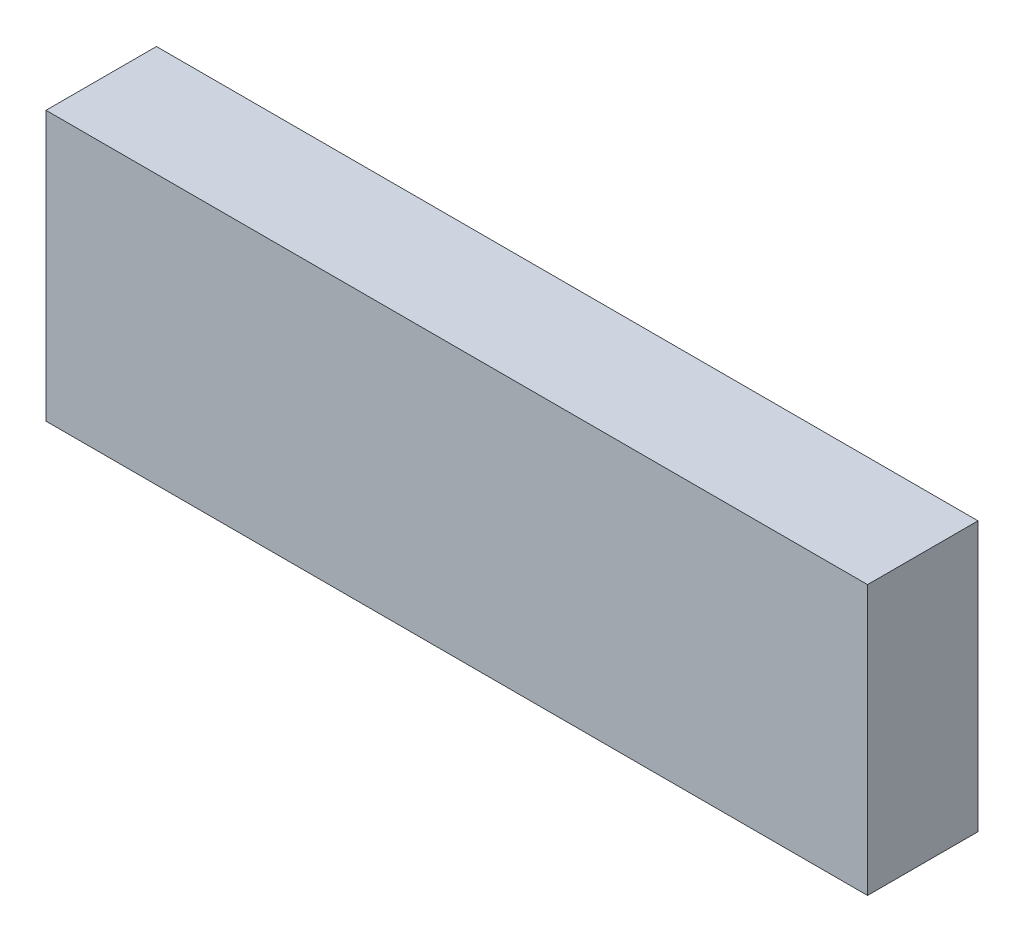
ISO-10303-21;
HEADER;
FILE_DESCRIPTION(('STEP AP214'),'2;1');
FILE_NAME('part.step','',(''),(''),'','','');
FILE_SCHEMA(('AUTOMOTIVE_DESIGN { 1 0 10303 214 1 1 1 1 }'));
ENDSEC;
DATA;
#1=APPLICATION_CONTEXT('core data for automotive mechanical design processes');
#2=APPLICATION_PROTOCOL_DEFINITION('international standard','automotive_design',2000,#1);
#3=PRODUCT_CONTEXT('',#1,'mechanical');
#4=PRODUCT('Part','Part','',(#3));
#5=PRODUCT_RELATED_PRODUCT_CATEGORY('part','',(#4));
#6=PRODUCT_DEFINITION_FORMATION('','',#4);
#7=PRODUCT_DEFINITION_CONTEXT('part definition',#1,'design');
#8=PRODUCT_DEFINITION('design','',#6,#7);
#9=PRODUCT_DEFINITION_SHAPE('','',#8);
#10=(LENGTH_UNIT() NAMED_UNIT(*) SI_UNIT(.MILLI.,.METRE.));
#11=(NAMED_UNIT(*) PLANE_ANGLE_UNIT() SI_UNIT($,.RADIAN.));
#12=(NAMED_UNIT(*) SI_UNIT($,.STERADIAN.) SOLID_ANGLE_UNIT());
#13=UNCERTAINTY_MEASURE_WITH_UNIT(LENGTH_MEASURE(1.E-05),#10,'distance_accuracy_value','');
#14=(GEOMETRIC_REPRESENTATION_CONTEXT(3) GLOBAL_UNCERTAINTY_ASSIGNED_CONTEXT((#13)) GLOBAL_UNIT_ASSIGNED_CONTEXT((#10,
#11,#12)) REPRESENTATION_CONTEXT('',''));
#15=CARTESIAN_POINT('',(0.,0.,0.));
#16=DIRECTION('',(0.,0.,1.));
#17=DIRECTION('',(1.,0.,0.));
#18=AXIS2_PLACEMENT_3D('',#15,#16,#17);
#19=CARTESIAN_POINT('',(11.9,-3.9,3.2));
#20=DIRECTION('',(-1.,0.,0.));
#21=DIRECTION('',(0.,0.,1.));
#22=AXIS2_PLACEMENT_3D('',#19,#20,#21);
#23=PLANE('',#22);
#24=DIRECTION('',(0.,1.,0.));
#25=VECTOR('',#24,1.);
#26=CARTESIAN_POINT('',(11.9,-3.9,0.));
#27=LINE('',#26,#25);
#28=CARTESIAN_POINT('',(11.9,-3.9,0.));
#29=VERTEX_POINT('',#28);
#30=CARTESIAN_POINT('',(11.9,3.9,0.));
#31=VERTEX_POINT('',#30);
#32=EDGE_CURVE('E98',#29,#31,#27,.T.);
#33=ORIENTED_EDGE('',*,*,#32,.T.);
#34=DIRECTION('',(0.,0.,-1.));
#35=VECTOR('',#34,1.);
#36=CARTESIAN_POINT('',(11.9,3.9,3.2));
#37=LINE('',#36,#35);
#38=CARTESIAN_POINT('',(11.9,3.9,3.2));
#39=VERTEX_POINT('',#38);
#40=EDGE_CURVE('E11',#39,#31,#37,.T.);
#41=ORIENTED_EDGE('',*,*,#40,.F.);
#42=DIRECTION('',(0.,1.,0.));
#43=VECTOR('',#42,1.);
#44=CARTESIAN_POINT('',(11.9,-3.9,3.2));
#45=LINE('',#44,#43);
#46=CARTESIAN_POINT('',(11.9,-3.9,3.2));
#47=VERTEX_POINT('',#46);
#48=EDGE_CURVE('E86',#47,#39,#45,.T.);
#49=ORIENTED_EDGE('',*,*,#48,.F.);
#50=DIRECTION('',(0.,0.,-1.));
#51=VECTOR('',#50,1.);
#52=CARTESIAN_POINT('',(11.9,-3.9,3.2));
#53=LINE('',#52,#51);
#54=EDGE_CURVE('E94',#47,#29,#53,.T.);
#55=ORIENTED_EDGE('',*,*,#54,.T.);
#56=EDGE_LOOP('',(#33,#41,#49,#55));
#57=FACE_BOUND('',#56,.T.);
#58=ADVANCED_FACE('F35',(#57),#23,.F.);
#59=CARTESIAN_POINT('',(-11.9,3.9,3.2));
#60=DIRECTION('',(0.,-1.,0.));
#61=DIRECTION('',(0.,0.,-1.));
#62=AXIS2_PLACEMENT_3D('',#59,#60,#61);
#63=PLANE('',#62);
#64=DIRECTION('',(-1.,0.,0.));
#65=VECTOR('',#64,1.);
#66=CARTESIAN_POINT('',(-11.9,3.9,0.));
#67=LINE('',#66,#65);
#68=CARTESIAN_POINT('',(-11.9,3.9,0.));
#69=VERTEX_POINT('',#68);
#70=EDGE_CURVE('E90',#31,#69,#67,.T.);
#71=ORIENTED_EDGE('',*,*,#70,.T.);
#72=DIRECTION('',(0.,0.,-1.));
#73=VECTOR('',#72,1.);
#74=CARTESIAN_POINT('',(-11.9,3.9,3.2));
#75=LINE('',#74,#73);
#76=CARTESIAN_POINT('',(-11.9,3.9,3.2));
#77=VERTEX_POINT('',#76);
#78=EDGE_CURVE('E43',#77,#69,#75,.T.);
#79=ORIENTED_EDGE('',*,*,#78,.F.);
#80=DIRECTION('',(-1.,0.,0.));
#81=VECTOR('',#80,1.);
#82=CARTESIAN_POINT('',(-11.9,3.9,3.2));
#83=LINE('',#82,#81);
#84=EDGE_CURVE('E81',#39,#77,#83,.T.);
#85=ORIENTED_EDGE('',*,*,#84,.F.);
#86=ORIENTED_EDGE('',*,*,#40,.T.);
#87=EDGE_LOOP('',(#71,#79,#85,#86));
#88=FACE_BOUND('',#87,.T.);
#89=ADVANCED_FACE('F89',(#88),#63,.F.);
#90=CARTESIAN_POINT('',(-11.9,-3.9,3.2));
#91=DIRECTION('',(1.,0.,0.));
#92=DIRECTION('',(0.,0.,-1.));
#93=AXIS2_PLACEMENT_3D('',#90,#91,#92);
#94=PLANE('',#93);
#95=DIRECTION('',(0.,-1.,0.));
#96=VECTOR('',#95,1.);
#97=CARTESIAN_POINT('',(-11.9,-3.9,0.));
#98=LINE('',#97,#96);
#99=CARTESIAN_POINT('',(-11.9,-3.9,0.));
#100=VERTEX_POINT('',#99);
#101=EDGE_CURVE('E68',#69,#100,#98,.T.);
#102=ORIENTED_EDGE('',*,*,#101,.T.);
#103=DIRECTION('',(0.,0.,-1.));
#104=VECTOR('',#103,1.);
#105=CARTESIAN_POINT('',(-11.9,-3.9,3.2));
#106=LINE('',#105,#104);
#107=CARTESIAN_POINT('',(-11.9,-3.9,3.2));
#108=VERTEX_POINT('',#107);
#109=EDGE_CURVE('E91',#108,#100,#106,.T.);
#110=ORIENTED_EDGE('',*,*,#109,.F.);
#111=DIRECTION('',(0.,-1.,0.));
#112=VECTOR('',#111,1.);
#113=CARTESIAN_POINT('',(-11.9,-3.9,3.2));
#114=LINE('',#113,#112);
#115=EDGE_CURVE('E84',#77,#108,#114,.T.);
#116=ORIENTED_EDGE('',*,*,#115,.F.);
#117=ORIENTED_EDGE('',*,*,#78,.T.);
#118=EDGE_LOOP('',(#102,#110,#116,#117));
#119=FACE_BOUND('',#118,.T.);
#120=ADVANCED_FACE('F92',(#119),#94,.F.);
#121=CARTESIAN_POINT('',(-11.9,-3.9,3.2));
#122=DIRECTION('',(0.,1.,0.));
#123=DIRECTION('',(0.,0.,1.));
#124=AXIS2_PLACEMENT_3D('',#121,#122,#123);
#125=PLANE('',#124);
#126=DIRECTION('',(1.,0.,0.));
#127=VECTOR('',#126,1.);
#128=CARTESIAN_POINT('',(-11.9,-3.9,0.));
#129=LINE('',#128,#127);
#130=EDGE_CURVE('E74',#100,#29,#129,.T.);
#131=ORIENTED_EDGE('',*,*,#130,.T.);
#132=ORIENTED_EDGE('',*,*,#54,.F.);
#133=DIRECTION('',(1.,0.,0.));
#134=VECTOR('',#133,1.);
#135=CARTESIAN_POINT('',(-11.9,-3.9,3.2));
#136=LINE('',#135,#134);
#137=EDGE_CURVE('E51',#108,#47,#136,.T.);
#138=ORIENTED_EDGE('',*,*,#137,.F.);
#139=ORIENTED_EDGE('',*,*,#109,.T.);
#140=EDGE_LOOP('',(#131,#132,#138,#139));
#141=FACE_BOUND('',#140,.T.);
#142=ADVANCED_FACE('F106',(#141),#125,.F.);
#143=CARTESIAN_POINT('',(0.,0.,3.2));
#144=DIRECTION('',(0.,0.,-1.));
#145=DIRECTION('',(-1.,0.,0.));
#146=AXIS2_PLACEMENT_3D('',#143,#144,#145);
#147=PLANE('',#146);
#148=ORIENTED_EDGE('',*,*,#48,.T.);
#149=ORIENTED_EDGE('',*,*,#84,.T.);
#150=ORIENTED_EDGE('',*,*,#115,.T.);
#151=ORIENTED_EDGE('',*,*,#137,.T.);
#152=EDGE_LOOP('',(#148,#149,#150,#151));
#153=FACE_BOUND('',#152,.T.);
#154=ADVANCED_FACE('F82',(#153),#147,.F.);
#155=CARTESIAN_POINT('',(0.,0.,0.));
#156=DIRECTION('',(0.,0.,-1.));
#157=DIRECTION('',(-1.,0.,0.));
#158=AXIS2_PLACEMENT_3D('',#155,#156,#157);
#159=PLANE('',#158);
#160=CARTESIAN_POINT('',(8.,0.,0.));
#161=DIRECTION('',(0.,0.,-1.));
#162=DIRECTION('',(-1.,0.,0.));
#163=AXIS2_PLACEMENT_3D('',#160,#161,#162);
#164=CIRCLE('',#163,2.5);
#165=CARTESIAN_POINT('',(5.5,0.,0.));
#166=VERTEX_POINT('',#165);
#167=EDGE_CURVE('E124',#166,#166,#164,.T.);
#168=ORIENTED_EDGE('',*,*,#167,.F.);
#169=EDGE_LOOP('',(#168));
#170=FACE_BOUND('',#169,.T.);
#171=CARTESIAN_POINT('',(-8.,0.,0.));
#172=DIRECTION('',(0.,0.,-1.));
#173=DIRECTION('',(-1.,0.,0.));
#174=AXIS2_PLACEMENT_3D('',#171,#172,#173);
#175=CIRCLE('',#174,2.5);
#176=CARTESIAN_POINT('',(-10.5,0.,0.));
#177=VERTEX_POINT('',#176);
#178=EDGE_CURVE('E118',#177,#177,#175,.T.);
#179=ORIENTED_EDGE('',*,*,#178,.F.);
#180=EDGE_LOOP('',(#179));
#181=FACE_BOUND('',#180,.T.);
#182=CARTESIAN_POINT('',(0.,0.,0.));
#183=DIRECTION('',(0.,0.,-1.));
#184=DIRECTION('',(-1.,0.,0.));
#185=AXIS2_PLACEMENT_3D('',#182,#183,#184);
#186=CIRCLE('',#185,2.5);
#187=CARTESIAN_POINT('',(-2.5,0.,0.));
#188=VERTEX_POINT('',#187);
#189=EDGE_CURVE('E112',#188,#188,#186,.T.);
#190=ORIENTED_EDGE('',*,*,#189,.F.);
#191=EDGE_LOOP('',(#190));
#192=FACE_BOUND('',#191,.T.);
#193=ORIENTED_EDGE('',*,*,#32,.F.);
#194=ORIENTED_EDGE('',*,*,#130,.F.);
#195=ORIENTED_EDGE('',*,*,#101,.F.);
#196=ORIENTED_EDGE('',*,*,#70,.F.);
#197=EDGE_LOOP('',(#193,#194,#195,#196));
#198=FACE_BOUND('',#197,.T.);
#199=ADVANCED_FACE('F109',(#170,#181,#192,#198),#159,.T.);
#200=CARTESIAN_POINT('',(0.,0.,1.8));
#201=DIRECTION('',(0.,0.,-1.));
#202=DIRECTION('',(-1.,0.,0.));
#203=AXIS2_PLACEMENT_3D('',#200,#201,#202);
#204=CYLINDRICAL_SURFACE('',#203,2.5);
#205=CARTESIAN_POINT('',(0.,0.,1.8));
#206=DIRECTION('',(0.,0.,-1.));
#207=DIRECTION('',(-1.,0.,0.));
#208=AXIS2_PLACEMENT_3D('',#205,#206,#207);
#209=CIRCLE('',#208,2.5);
#210=CARTESIAN_POINT('',(-2.5,0.,1.8));
#211=VERTEX_POINT('',#210);
#212=EDGE_CURVE('E101',#211,#211,#209,.T.);
#213=ORIENTED_EDGE('',*,*,#212,.F.);
#214=EDGE_LOOP('',(#213));
#215=FACE_BOUND('',#214,.T.);
#216=ORIENTED_EDGE('',*,*,#189,.T.);
#217=EDGE_LOOP('',(#216));
#218=FACE_BOUND('',#217,.T.);
#219=ADVANCED_FACE('F141',(#215,#218),#204,.F.);
#220=CARTESIAN_POINT('',(0.,0.,1.8));
#221=DIRECTION('',(0.,0.,-1.));
#222=DIRECTION('',(-1.,0.,0.));
#223=AXIS2_PLACEMENT_3D('',#220,#221,#222);
#224=PLANE('',#223);
#225=ORIENTED_EDGE('',*,*,#212,.T.);
#226=EDGE_LOOP('',(#225));
#227=FACE_BOUND('',#226,.T.);
#228=ADVANCED_FACE('F148',(#227),#224,.T.);
#229=CARTESIAN_POINT('',(-8.,0.,1.8));
#230=DIRECTION('',(0.,0.,-1.));
#231=DIRECTION('',(-1.,0.,0.));
#232=AXIS2_PLACEMENT_3D('',#229,#230,#231);
#233=CYLINDRICAL_SURFACE('',#232,2.5);
#234=CARTESIAN_POINT('',(-8.,0.,1.8));
#235=DIRECTION('',(0.,0.,-1.));
#236=DIRECTION('',(-1.,0.,0.));
#237=AXIS2_PLACEMENT_3D('',#234,#235,#236);
#238=CIRCLE('',#237,2.5);
#239=CARTESIAN_POINT('',(-10.5,0.,1.8));
#240=VERTEX_POINT('',#239);
#241=EDGE_CURVE('E115',#240,#240,#238,.T.);
#242=ORIENTED_EDGE('',*,*,#241,.F.);
#243=EDGE_LOOP('',(#242));
#244=FACE_BOUND('',#243,.T.);
#245=ORIENTED_EDGE('',*,*,#178,.T.);
#246=EDGE_LOOP('',(#245));
#247=FACE_BOUND('',#246,.T.);
#248=ADVANCED_FACE('F154',(#244,#247),#233,.F.);
#249=CARTESIAN_POINT('',(-8.,0.,1.8));
#250=DIRECTION('',(0.,0.,-1.));
#251=DIRECTION('',(-1.,0.,0.));
#252=AXIS2_PLACEMENT_3D('',#249,#250,#251);
#253=PLANE('',#252);
#254=ORIENTED_EDGE('',*,*,#241,.T.);
#255=EDGE_LOOP('',(#254));
#256=FACE_BOUND('',#255,.T.);
#257=ADVANCED_FACE('F135',(#256),#253,.T.);
#258=CARTESIAN_POINT('',(8.,0.,1.8));
#259=DIRECTION('',(0.,0.,-1.));
#260=DIRECTION('',(-1.,0.,0.));
#261=AXIS2_PLACEMENT_3D('',#258,#259,#260);
#262=CYLINDRICAL_SURFACE('',#261,2.5);
#263=CARTESIAN_POINT('',(8.,0.,1.8));
#264=DIRECTION('',(0.,0.,-1.));
#265=DIRECTION('',(-1.,0.,0.));
#266=AXIS2_PLACEMENT_3D('',#263,#264,#265);
#267=CIRCLE('',#266,2.5);
#268=CARTESIAN_POINT('',(5.5,0.,1.8));
#269=VERTEX_POINT('',#268);
#270=EDGE_CURVE('E121',#269,#269,#267,.T.);
#271=ORIENTED_EDGE('',*,*,#270,.F.);
#272=EDGE_LOOP('',(#271));
#273=FACE_BOUND('',#272,.T.);
#274=ORIENTED_EDGE('',*,*,#167,.T.);
#275=EDGE_LOOP('',(#274));
#276=FACE_BOUND('',#275,.T.);
#277=ADVANCED_FACE('F132',(#273,#276),#262,.F.);
#278=CARTESIAN_POINT('',(8.,0.,1.8));
#279=DIRECTION('',(0.,0.,-1.));
#280=DIRECTION('',(-1.,0.,0.));
#281=AXIS2_PLACEMENT_3D('',#278,#279,#280);
#282=PLANE('',#281);
#283=ORIENTED_EDGE('',*,*,#270,.T.);
#284=EDGE_LOOP('',(#283));
#285=FACE_BOUND('',#284,.T.);
#286=ADVANCED_FACE('F130',(#285),#282,.T.);
#287=CLOSED_SHELL('',(#58,#89,#120,#142,#154,#199,#219,#228,#248,#257,#277,#286));
#288=MANIFOLD_SOLID_BREP('B2',#287);
#289=ADVANCED_BREP_SHAPE_REPRESENTATION('',(#18,#288),#14);
#290=SHAPE_DEFINITION_REPRESENTATION(#9,#289);
ENDSEC;
END-ISO-10303-21;
